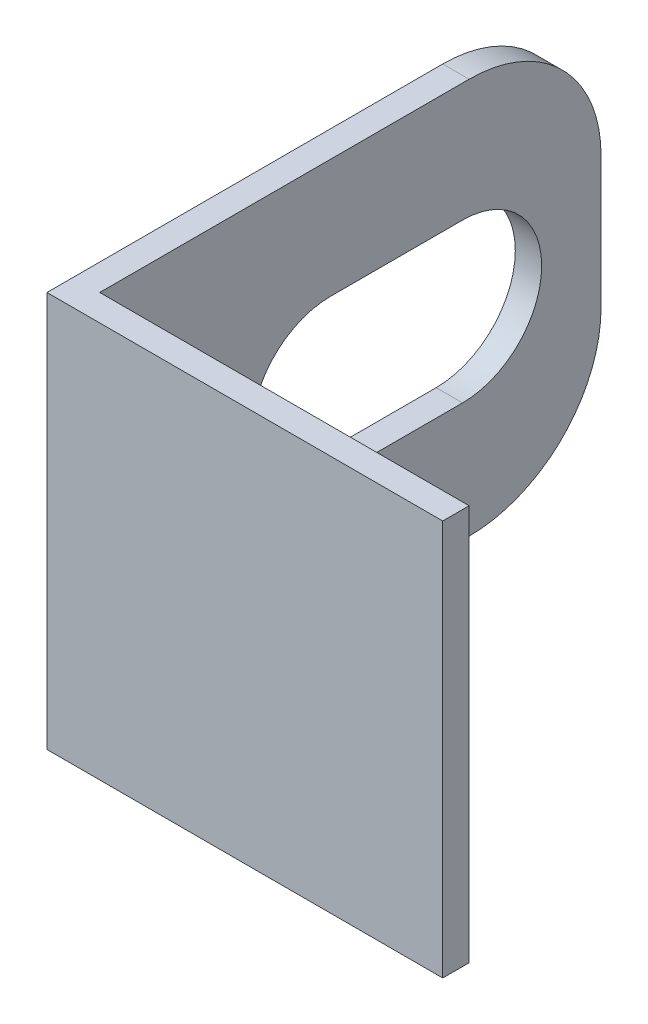
ISO-10303-21;
HEADER;
FILE_DESCRIPTION(('STEP AP214'),'2;1');
FILE_NAME('part.step','',(''),(''),'','','');
FILE_SCHEMA(('AUTOMOTIVE_DESIGN { 1 0 10303 214 1 1 1 1 }'));
ENDSEC;
DATA;
#1=APPLICATION_CONTEXT('core data for automotive mechanical design processes');
#2=APPLICATION_PROTOCOL_DEFINITION('international standard','automotive_design',2000,#1);
#3=PRODUCT_CONTEXT('',#1,'mechanical');
#4=PRODUCT('Part','Part','',(#3));
#5=PRODUCT_RELATED_PRODUCT_CATEGORY('part','',(#4));
#6=PRODUCT_DEFINITION_FORMATION('','',#4);
#7=PRODUCT_DEFINITION_CONTEXT('part definition',#1,'design');
#8=PRODUCT_DEFINITION('design','',#6,#7);
#9=PRODUCT_DEFINITION_SHAPE('','',#8);
#10=(LENGTH_UNIT() NAMED_UNIT(*) SI_UNIT(.MILLI.,.METRE.));
#11=(NAMED_UNIT(*) PLANE_ANGLE_UNIT() SI_UNIT($,.RADIAN.));
#12=(NAMED_UNIT(*) SI_UNIT($,.STERADIAN.) SOLID_ANGLE_UNIT());
#13=UNCERTAINTY_MEASURE_WITH_UNIT(LENGTH_MEASURE(1.E-05),#10,'distance_accuracy_value','');
#14=(GEOMETRIC_REPRESENTATION_CONTEXT(3) GLOBAL_UNCERTAINTY_ASSIGNED_CONTEXT((#13)) GLOBAL_UNIT_ASSIGNED_CONTEXT((#10,
#11,#12)) REPRESENTATION_CONTEXT('',''));
#15=CARTESIAN_POINT('',(0.,0.,0.));
#16=DIRECTION('',(0.,0.,1.));
#17=DIRECTION('',(1.,0.,0.));
#18=AXIS2_PLACEMENT_3D('',#15,#16,#17);
#19=CARTESIAN_POINT('',(0.,15.,20.));
#20=DIRECTION('',(0.,0.,-1.));
#21=DIRECTION('',(-1.,0.,0.));
#22=AXIS2_PLACEMENT_3D('',#19,#20,#21);
#23=PLANE('',#22);
#24=DIRECTION('',(1.,0.,0.));
#25=VECTOR('',#24,1.);
#26=CARTESIAN_POINT('',(0.,-15.,20.));
#27=LINE('',#26,#25);
#28=CARTESIAN_POINT('',(-1.,-15.,20.));
#29=VERTEX_POINT('',#28);
#30=CARTESIAN_POINT('',(29.,-15.,20.));
#31=VERTEX_POINT('',#30);
#32=EDGE_CURVE('E162',#29,#31,#27,.T.);
#33=ORIENTED_EDGE('',*,*,#32,.T.);
#34=DIRECTION('',(0.,-1.,0.));
#35=VECTOR('',#34,1.);
#36=CARTESIAN_POINT('',(29.,15.,20.));
#37=LINE('',#36,#35);
#38=CARTESIAN_POINT('',(29.,15.,20.));
#39=VERTEX_POINT('',#38);
#40=EDGE_CURVE('E203',#39,#31,#37,.T.);
#41=ORIENTED_EDGE('',*,*,#40,.F.);
#42=DIRECTION('',(1.,0.,0.));
#43=VECTOR('',#42,1.);
#44=CARTESIAN_POINT('',(0.,15.,20.));
#45=LINE('',#44,#43);
#46=CARTESIAN_POINT('',(-1.,15.,20.));
#47=VERTEX_POINT('',#46);
#48=EDGE_CURVE('E163',#47,#39,#45,.T.);
#49=ORIENTED_EDGE('',*,*,#48,.F.);
#50=DIRECTION('',(0.,-1.,0.));
#51=VECTOR('',#50,1.);
#52=CARTESIAN_POINT('',(-1.,15.,20.));
#53=LINE('',#52,#51);
#54=EDGE_CURVE('E178',#47,#29,#53,.T.);
#55=ORIENTED_EDGE('',*,*,#54,.T.);
#56=EDGE_LOOP('',(#33,#41,#49,#55));
#57=FACE_BOUND('',#56,.T.);
#58=ADVANCED_FACE('F36',(#57),#23,.F.);
#59=CARTESIAN_POINT('',(29.,15.,0.));
#60=DIRECTION('',(-1.,0.,0.));
#61=DIRECTION('',(0.,0.,1.));
#62=AXIS2_PLACEMENT_3D('',#59,#60,#61);
#63=PLANE('',#62);
#64=DIRECTION('',(0.,0.,-1.));
#65=VECTOR('',#64,1.);
#66=CARTESIAN_POINT('',(29.,-15.,0.));
#67=LINE('',#66,#65);
#68=CARTESIAN_POINT('',(29.,-15.,18.));
#69=VERTEX_POINT('',#68);
#70=EDGE_CURVE('E181',#31,#69,#67,.T.);
#71=ORIENTED_EDGE('',*,*,#70,.T.);
#72=DIRECTION('',(0.,-1.,0.));
#73=VECTOR('',#72,1.);
#74=CARTESIAN_POINT('',(29.,15.,18.));
#75=LINE('',#74,#73);
#76=CARTESIAN_POINT('',(29.,15.,18.));
#77=VERTEX_POINT('',#76);
#78=EDGE_CURVE('E201',#77,#69,#75,.T.);
#79=ORIENTED_EDGE('',*,*,#78,.F.);
#80=DIRECTION('',(0.,0.,-1.));
#81=VECTOR('',#80,1.);
#82=CARTESIAN_POINT('',(29.,15.,0.));
#83=LINE('',#82,#81);
#84=EDGE_CURVE('E166',#39,#77,#83,.T.);
#85=ORIENTED_EDGE('',*,*,#84,.F.);
#86=ORIENTED_EDGE('',*,*,#40,.T.);
#87=EDGE_LOOP('',(#71,#79,#85,#86));
#88=FACE_BOUND('',#87,.T.);
#89=ADVANCED_FACE('F250',(#88),#63,.F.);
#90=CARTESIAN_POINT('',(0.,15.,18.));
#91=DIRECTION('',(0.,0.,-1.));
#92=DIRECTION('',(-1.,0.,0.));
#93=AXIS2_PLACEMENT_3D('',#90,#91,#92);
#94=PLANE('',#93);
#95=DIRECTION('',(1.,0.,0.));
#96=VECTOR('',#95,1.);
#97=CARTESIAN_POINT('',(0.,-15.,18.));
#98=LINE('',#97,#96);
#99=CARTESIAN_POINT('',(1.,-15.,18.));
#100=VERTEX_POINT('',#99);
#101=EDGE_CURVE('E184',#100,#69,#98,.T.);
#102=ORIENTED_EDGE('',*,*,#101,.F.);
#103=DIRECTION('',(0.,-1.,0.));
#104=VECTOR('',#103,1.);
#105=CARTESIAN_POINT('',(1.,15.,18.));
#106=LINE('',#105,#104);
#107=CARTESIAN_POINT('',(1.,15.,18.));
#108=VERTEX_POINT('',#107);
#109=EDGE_CURVE('E199',#108,#100,#106,.T.);
#110=ORIENTED_EDGE('',*,*,#109,.F.);
#111=DIRECTION('',(1.,0.,0.));
#112=VECTOR('',#111,1.);
#113=CARTESIAN_POINT('',(0.,15.,18.));
#114=LINE('',#113,#112);
#115=EDGE_CURVE('E169',#108,#77,#114,.T.);
#116=ORIENTED_EDGE('',*,*,#115,.T.);
#117=ORIENTED_EDGE('',*,*,#78,.T.);
#118=EDGE_LOOP('',(#102,#110,#116,#117));
#119=FACE_BOUND('',#118,.T.);
#120=ADVANCED_FACE('F247',(#119),#94,.T.);
#121=CARTESIAN_POINT('',(1.,15.,0.));
#122=DIRECTION('',(-1.,0.,0.));
#123=DIRECTION('',(0.,0.,1.));
#124=AXIS2_PLACEMENT_3D('',#121,#122,#123);
#125=PLANE('',#124);
#126=DIRECTION('',(0.,0.,1.));
#127=VECTOR('',#126,1.);
#128=CARTESIAN_POINT('',(1.,-6.,0.));
#129=LINE('',#128,#127);
#130=CARTESIAN_POINT('',(1.,-6.,-9.49999999999999));
#131=VERTEX_POINT('',#130);
#132=CARTESIAN_POINT('',(1.,-6.,0.500000000000004));
#133=VERTEX_POINT('',#132);
#134=EDGE_CURVE('E149',#131,#133,#129,.T.);
#135=ORIENTED_EDGE('',*,*,#134,.T.);
#136=CARTESIAN_POINT('',(1.,0.,0.500000000000004));
#137=DIRECTION('',(-1.,0.,0.));
#138=DIRECTION('',(0.,0.,1.));
#139=AXIS2_PLACEMENT_3D('',#136,#137,#138);
#140=CIRCLE('',#139,6.);
#141=CARTESIAN_POINT('',(1.,6.,0.500000000000004));
#142=VERTEX_POINT('',#141);
#143=EDGE_CURVE('E130',#133,#142,#140,.T.);
#144=ORIENTED_EDGE('',*,*,#143,.T.);
#145=DIRECTION('',(0.,0.,-1.));
#146=VECTOR('',#145,1.);
#147=CARTESIAN_POINT('',(1.,6.,0.));
#148=LINE('',#147,#146);
#149=CARTESIAN_POINT('',(1.,6.,-9.5));
#150=VERTEX_POINT('',#149);
#151=EDGE_CURVE('E158',#142,#150,#148,.T.);
#152=ORIENTED_EDGE('',*,*,#151,.T.);
#153=CARTESIAN_POINT('',(1.,0.,-9.5));
#154=DIRECTION('',(-1.,0.,0.));
#155=DIRECTION('',(0.,0.,1.));
#156=AXIS2_PLACEMENT_3D('',#153,#154,#155);
#157=CIRCLE('',#156,6.);
#158=EDGE_CURVE('E155',#150,#131,#157,.T.);
#159=ORIENTED_EDGE('',*,*,#158,.T.);
#160=EDGE_LOOP('',(#135,#144,#152,#159));
#161=FACE_BOUND('',#160,.T.);
#162=DIRECTION('',(0.,0.,-1.));
#163=VECTOR('',#162,1.);
#164=CARTESIAN_POINT('',(1.,-15.,0.));
#165=LINE('',#164,#163);
#166=CARTESIAN_POINT('',(1.,-15.,-10.));
#167=VERTEX_POINT('',#166);
#168=EDGE_CURVE('E187',#100,#167,#165,.T.);
#169=ORIENTED_EDGE('',*,*,#168,.T.);
#170=CARTESIAN_POINT('',(1.,-5.,-10.));
#171=DIRECTION('',(-1.,0.,0.));
#172=DIRECTION('',(0.,0.,1.));
#173=AXIS2_PLACEMENT_3D('',#170,#171,#172);
#174=CIRCLE('',#173,10.);
#175=CARTESIAN_POINT('',(1.,-5.,-20.));
#176=VERTEX_POINT('',#175);
#177=EDGE_CURVE('E211',#167,#176,#174,.F.);
#178=ORIENTED_EDGE('',*,*,#177,.T.);
#179=DIRECTION('',(0.,-1.,0.));
#180=VECTOR('',#179,1.);
#181=CARTESIAN_POINT('',(1.,15.,-20.));
#182=LINE('',#181,#180);
#183=CARTESIAN_POINT('',(1.,5.,-20.));
#184=VERTEX_POINT('',#183);
#185=EDGE_CURVE('E196',#184,#176,#182,.T.);
#186=ORIENTED_EDGE('',*,*,#185,.F.);
#187=CARTESIAN_POINT('',(1.,5.,-10.));
#188=DIRECTION('',(-1.,0.,0.));
#189=DIRECTION('',(0.,0.,1.));
#190=AXIS2_PLACEMENT_3D('',#187,#188,#189);
#191=CIRCLE('',#190,10.);
#192=CARTESIAN_POINT('',(1.,15.,-10.));
#193=VERTEX_POINT('',#192);
#194=EDGE_CURVE('E209',#184,#193,#191,.F.);
#195=ORIENTED_EDGE('',*,*,#194,.T.);
#196=DIRECTION('',(0.,0.,-1.));
#197=VECTOR('',#196,1.);
#198=CARTESIAN_POINT('',(1.,15.,0.));
#199=LINE('',#198,#197);
#200=EDGE_CURVE('E172',#108,#193,#199,.T.);
#201=ORIENTED_EDGE('',*,*,#200,.F.);
#202=ORIENTED_EDGE('',*,*,#109,.T.);
#203=EDGE_LOOP('',(#169,#178,#186,#195,#201,#202));
#204=FACE_BOUND('',#203,.T.);
#205=ADVANCED_FACE('F232',(#161,#204),#125,.F.);
#206=CARTESIAN_POINT('',(0.,15.,-20.));
#207=DIRECTION('',(0.,0.,-1.));
#208=DIRECTION('',(-1.,0.,0.));
#209=AXIS2_PLACEMENT_3D('',#206,#207,#208);
#210=PLANE('',#209);
#211=ORIENTED_EDGE('',*,*,#185,.T.);
#212=DIRECTION('',(1.,0.,0.));
#213=VECTOR('',#212,1.);
#214=CARTESIAN_POINT('',(-1.,-5.,-20.));
#215=LINE('',#214,#213);
#216=CARTESIAN_POINT('',(-1.,-5.,-20.));
#217=VERTEX_POINT('',#216);
#218=EDGE_CURVE('E216',#176,#217,#215,.F.);
#219=ORIENTED_EDGE('',*,*,#218,.T.);
#220=DIRECTION('',(0.,-1.,0.));
#221=VECTOR('',#220,1.);
#222=CARTESIAN_POINT('',(-1.,15.,-20.));
#223=LINE('',#222,#221);
#224=CARTESIAN_POINT('',(-1.,5.,-20.));
#225=VERTEX_POINT('',#224);
#226=EDGE_CURVE('E193',#225,#217,#223,.T.);
#227=ORIENTED_EDGE('',*,*,#226,.F.);
#228=DIRECTION('',(1.,0.,0.));
#229=VECTOR('',#228,1.);
#230=CARTESIAN_POINT('',(0.,5.,-20.));
#231=LINE('',#230,#229);
#232=EDGE_CURVE('E213',#225,#184,#231,.T.);
#233=ORIENTED_EDGE('',*,*,#232,.T.);
#234=EDGE_LOOP('',(#211,#219,#227,#233));
#235=FACE_BOUND('',#234,.T.);
#236=ADVANCED_FACE('F234',(#235),#210,.T.);
#237=CARTESIAN_POINT('',(-1.,15.,0.));
#238=DIRECTION('',(-1.,0.,0.));
#239=DIRECTION('',(0.,0.,1.));
#240=AXIS2_PLACEMENT_3D('',#237,#238,#239);
#241=PLANE('',#240);
#242=CARTESIAN_POINT('',(-1.,0.,0.500000000000004));
#243=DIRECTION('',(1.,0.,0.));
#244=DIRECTION('',(0.,0.,-1.));
#245=AXIS2_PLACEMENT_3D('',#242,#243,#244);
#246=CIRCLE('',#245,6.);
#247=CARTESIAN_POINT('',(-1.,6.,0.500000000000004));
#248=VERTEX_POINT('',#247);
#249=CARTESIAN_POINT('',(-1.,-6.,0.500000000000004));
#250=VERTEX_POINT('',#249);
#251=EDGE_CURVE('E127',#248,#250,#246,.T.);
#252=ORIENTED_EDGE('',*,*,#251,.T.);
#253=DIRECTION('',(0.,0.,-1.));
#254=VECTOR('',#253,1.);
#255=CARTESIAN_POINT('',(-1.,-6.,0.500000000000004));
#256=LINE('',#255,#254);
#257=CARTESIAN_POINT('',(-1.,-6.,-9.49999999999999));
#258=VERTEX_POINT('',#257);
#259=EDGE_CURVE('E136',#250,#258,#256,.T.);
#260=ORIENTED_EDGE('',*,*,#259,.T.);
#261=CARTESIAN_POINT('',(-1.,0.,-9.5));
#262=DIRECTION('',(1.,0.,0.));
#263=DIRECTION('',(0.,0.,-1.));
#264=AXIS2_PLACEMENT_3D('',#261,#262,#263);
#265=CIRCLE('',#264,6.);
#266=CARTESIAN_POINT('',(-1.,6.,-9.5));
#267=VERTEX_POINT('',#266);
#268=EDGE_CURVE('E59',#258,#267,#265,.T.);
#269=ORIENTED_EDGE('',*,*,#268,.T.);
#270=DIRECTION('',(0.,0.,1.));
#271=VECTOR('',#270,1.);
#272=CARTESIAN_POINT('',(-1.,6.,0.500000000000004));
#273=LINE('',#272,#271);
#274=EDGE_CURVE('E133',#267,#248,#273,.T.);
#275=ORIENTED_EDGE('',*,*,#274,.T.);
#276=EDGE_LOOP('',(#252,#260,#269,#275));
#277=FACE_BOUND('',#276,.T.);
#278=ORIENTED_EDGE('',*,*,#226,.T.);
#279=CARTESIAN_POINT('',(-1.,-5.,-10.));
#280=DIRECTION('',(-1.,0.,0.));
#281=DIRECTION('',(0.,0.,1.));
#282=AXIS2_PLACEMENT_3D('',#279,#280,#281);
#283=CIRCLE('',#282,10.);
#284=CARTESIAN_POINT('',(-1.,-15.,-10.));
#285=VERTEX_POINT('',#284);
#286=EDGE_CURVE('E44',#217,#285,#283,.T.);
#287=ORIENTED_EDGE('',*,*,#286,.T.);
#288=DIRECTION('',(0.,0.,-1.));
#289=VECTOR('',#288,1.);
#290=CARTESIAN_POINT('',(-1.,-15.,0.));
#291=LINE('',#290,#289);
#292=EDGE_CURVE('E167',#29,#285,#291,.T.);
#293=ORIENTED_EDGE('',*,*,#292,.F.);
#294=ORIENTED_EDGE('',*,*,#54,.F.);
#295=DIRECTION('',(0.,0.,-1.));
#296=VECTOR('',#295,1.);
#297=CARTESIAN_POINT('',(-1.,15.,0.));
#298=LINE('',#297,#296);
#299=CARTESIAN_POINT('',(-1.,15.,-10.));
#300=VERTEX_POINT('',#299);
#301=EDGE_CURVE('E175',#47,#300,#298,.T.);
#302=ORIENTED_EDGE('',*,*,#301,.T.);
#303=CARTESIAN_POINT('',(-1.,5.,-10.));
#304=DIRECTION('',(-1.,0.,0.));
#305=DIRECTION('',(0.,0.,1.));
#306=AXIS2_PLACEMENT_3D('',#303,#304,#305);
#307=CIRCLE('',#306,10.);
#308=EDGE_CURVE('E218',#300,#225,#307,.T.);
#309=ORIENTED_EDGE('',*,*,#308,.T.);
#310=EDGE_LOOP('',(#278,#287,#293,#294,#302,#309));
#311=FACE_BOUND('',#310,.T.);
#312=ADVANCED_FACE('F140',(#277,#311),#241,.T.);
#313=CARTESIAN_POINT('',(0.,15.,0.));
#314=DIRECTION('',(0.,1.,0.));
#315=DIRECTION('',(0.,0.,1.));
#316=AXIS2_PLACEMENT_3D('',#313,#314,#315);
#317=PLANE('',#316);
#318=ORIENTED_EDGE('',*,*,#200,.T.);
#319=DIRECTION('',(1.,0.,0.));
#320=VECTOR('',#319,1.);
#321=CARTESIAN_POINT('',(0.,15.,-10.));
#322=LINE('',#321,#320);
#323=EDGE_CURVE('E11',#193,#300,#322,.F.);
#324=ORIENTED_EDGE('',*,*,#323,.T.);
#325=ORIENTED_EDGE('',*,*,#301,.F.);
#326=ORIENTED_EDGE('',*,*,#48,.T.);
#327=ORIENTED_EDGE('',*,*,#84,.T.);
#328=ORIENTED_EDGE('',*,*,#115,.F.);
#329=EDGE_LOOP('',(#318,#324,#325,#326,#327,#328));
#330=FACE_BOUND('',#329,.T.);
#331=ADVANCED_FACE('F242',(#330),#317,.T.);
#332=CARTESIAN_POINT('',(0.,-15.,0.));
#333=DIRECTION('',(0.,1.,0.));
#334=DIRECTION('',(0.,0.,1.));
#335=AXIS2_PLACEMENT_3D('',#332,#333,#334);
#336=PLANE('',#335);
#337=ORIENTED_EDGE('',*,*,#292,.T.);
#338=DIRECTION('',(1.,0.,0.));
#339=VECTOR('',#338,1.);
#340=CARTESIAN_POINT('',(1.,-15.,-10.));
#341=LINE('',#340,#339);
#342=EDGE_CURVE('E206',#285,#167,#341,.T.);
#343=ORIENTED_EDGE('',*,*,#342,.T.);
#344=ORIENTED_EDGE('',*,*,#168,.F.);
#345=ORIENTED_EDGE('',*,*,#101,.T.);
#346=ORIENTED_EDGE('',*,*,#70,.F.);
#347=ORIENTED_EDGE('',*,*,#32,.F.);
#348=EDGE_LOOP('',(#337,#343,#344,#345,#346,#347));
#349=FACE_BOUND('',#348,.T.);
#350=ADVANCED_FACE('F227',(#349),#336,.F.);
#351=CARTESIAN_POINT('',(0.,-5.,-10.));
#352=DIRECTION('',(-1.,0.,0.));
#353=DIRECTION('',(0.,0.,1.));
#354=AXIS2_PLACEMENT_3D('',#351,#352,#353);
#355=CYLINDRICAL_SURFACE('',#354,10.);
#356=ORIENTED_EDGE('',*,*,#286,.F.);
#357=ORIENTED_EDGE('',*,*,#218,.F.);
#358=ORIENTED_EDGE('',*,*,#177,.F.);
#359=ORIENTED_EDGE('',*,*,#342,.F.);
#360=EDGE_LOOP('',(#356,#357,#358,#359));
#361=FACE_BOUND('',#360,.T.);
#362=ADVANCED_FACE('F229',(#361),#355,.T.);
#363=CARTESIAN_POINT('',(0.,5.,-10.));
#364=DIRECTION('',(1.,0.,0.));
#365=DIRECTION('',(0.,0.,-1.));
#366=AXIS2_PLACEMENT_3D('',#363,#364,#365);
#367=CYLINDRICAL_SURFACE('',#366,10.);
#368=ORIENTED_EDGE('',*,*,#308,.F.);
#369=ORIENTED_EDGE('',*,*,#323,.F.);
#370=ORIENTED_EDGE('',*,*,#194,.F.);
#371=ORIENTED_EDGE('',*,*,#232,.F.);
#372=EDGE_LOOP('',(#368,#369,#370,#371));
#373=FACE_BOUND('',#372,.T.);
#374=ADVANCED_FACE('F38',(#373),#367,.T.);
#375=CARTESIAN_POINT('',(-1.,0.,0.500000000000004));
#376=DIRECTION('',(1.,0.,0.));
#377=DIRECTION('',(0.,0.,-1.));
#378=AXIS2_PLACEMENT_3D('',#375,#376,#377);
#379=CYLINDRICAL_SURFACE('',#378,6.);
#380=DIRECTION('',(1.,0.,0.));
#381=VECTOR('',#380,1.);
#382=CARTESIAN_POINT('',(-1.,-6.,0.500000000000004));
#383=LINE('',#382,#381);
#384=EDGE_CURVE('E51',#250,#133,#383,.T.);
#385=ORIENTED_EDGE('',*,*,#384,.F.);
#386=ORIENTED_EDGE('',*,*,#251,.F.);
#387=DIRECTION('',(1.,0.,0.));
#388=VECTOR('',#387,1.);
#389=CARTESIAN_POINT('',(-1.,6.,0.500000000000004));
#390=LINE('',#389,#388);
#391=EDGE_CURVE('E147',#248,#142,#390,.T.);
#392=ORIENTED_EDGE('',*,*,#391,.T.);
#393=ORIENTED_EDGE('',*,*,#143,.F.);
#394=EDGE_LOOP('',(#385,#386,#392,#393));
#395=FACE_BOUND('',#394,.T.);
#396=ADVANCED_FACE('F124',(#395),#379,.F.);
#397=CARTESIAN_POINT('',(-1.,6.,0.500000000000004));
#398=DIRECTION('',(0.,1.,0.));
#399=DIRECTION('',(0.,0.,1.));
#400=AXIS2_PLACEMENT_3D('',#397,#398,#399);
#401=PLANE('',#400);
#402=ORIENTED_EDGE('',*,*,#391,.F.);
#403=ORIENTED_EDGE('',*,*,#274,.F.);
#404=DIRECTION('',(1.,0.,0.));
#405=VECTOR('',#404,1.);
#406=CARTESIAN_POINT('',(-1.,6.,-9.5));
#407=LINE('',#406,#405);
#408=EDGE_CURVE('E150',#267,#150,#407,.T.);
#409=ORIENTED_EDGE('',*,*,#408,.T.);
#410=ORIENTED_EDGE('',*,*,#151,.F.);
#411=EDGE_LOOP('',(#402,#403,#409,#410));
#412=FACE_BOUND('',#411,.T.);
#413=ADVANCED_FACE('F324',(#412),#401,.F.);
#414=CARTESIAN_POINT('',(-1.,0.,-9.5));
#415=DIRECTION('',(1.,0.,0.));
#416=DIRECTION('',(0.,0.,-1.));
#417=AXIS2_PLACEMENT_3D('',#414,#415,#416);
#418=CYLINDRICAL_SURFACE('',#417,6.);
#419=ORIENTED_EDGE('',*,*,#408,.F.);
#420=ORIENTED_EDGE('',*,*,#268,.F.);
#421=DIRECTION('',(1.,0.,0.));
#422=VECTOR('',#421,1.);
#423=CARTESIAN_POINT('',(-1.,-6.,-9.49999999999999));
#424=LINE('',#423,#422);
#425=EDGE_CURVE('E132',#258,#131,#424,.T.);
#426=ORIENTED_EDGE('',*,*,#425,.T.);
#427=ORIENTED_EDGE('',*,*,#158,.F.);
#428=EDGE_LOOP('',(#419,#420,#426,#427));
#429=FACE_BOUND('',#428,.T.);
#430=ADVANCED_FACE('F329',(#429),#418,.F.);
#431=CARTESIAN_POINT('',(-1.,-6.,0.500000000000004));
#432=DIRECTION('',(0.,-1.,0.));
#433=DIRECTION('',(0.,0.,-1.));
#434=AXIS2_PLACEMENT_3D('',#431,#432,#433);
#435=PLANE('',#434);
#436=ORIENTED_EDGE('',*,*,#425,.F.);
#437=ORIENTED_EDGE('',*,*,#259,.F.);
#438=ORIENTED_EDGE('',*,*,#384,.T.);
#439=ORIENTED_EDGE('',*,*,#134,.F.);
#440=EDGE_LOOP('',(#436,#437,#438,#439));
#441=FACE_BOUND('',#440,.T.);
#442=ADVANCED_FACE('F137',(#441),#435,.F.);
#443=CLOSED_SHELL('',(#58,#89,#120,#205,#236,#312,#331,#350,#362,#374,#396,#413,#430,#442));
#444=MANIFOLD_SOLID_BREP('B2',#443);
#445=ADVANCED_BREP_SHAPE_REPRESENTATION('',(#18,#444),#14);
#446=SHAPE_DEFINITION_REPRESENTATION(#9,#445);
ENDSEC;
END-ISO-10303-21;
